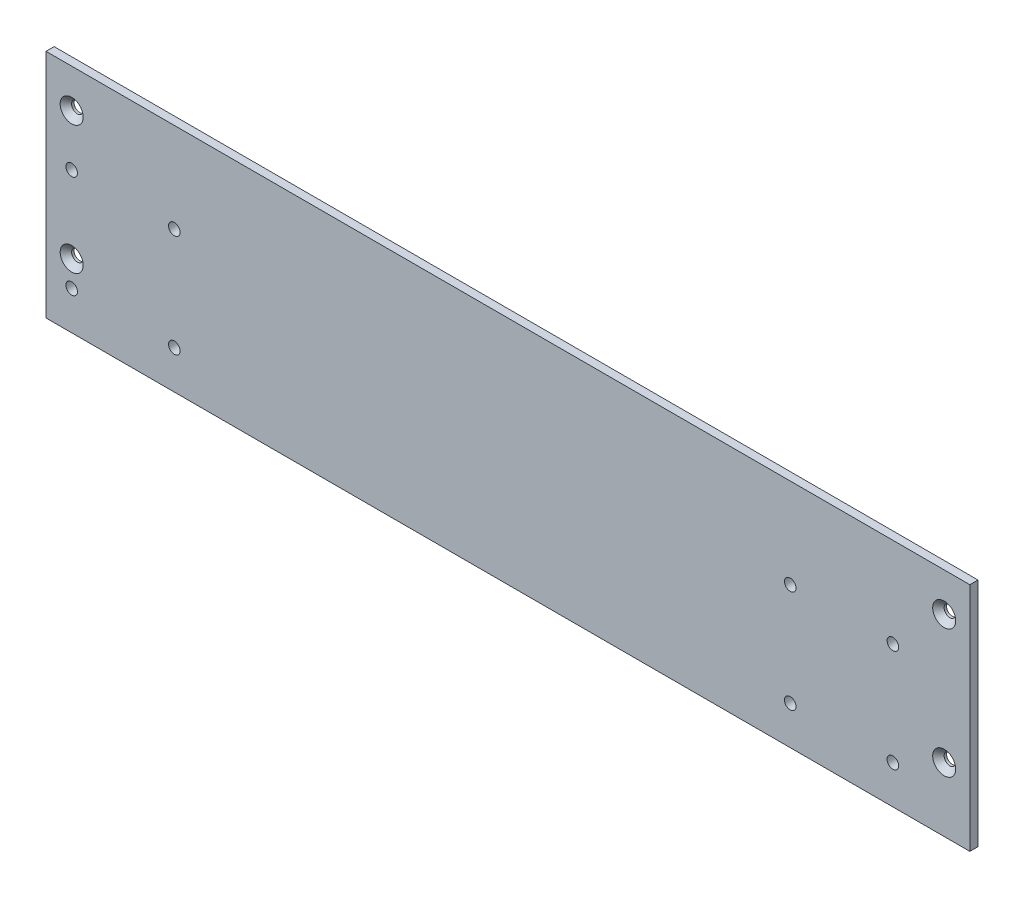
ISO-10303-21;
HEADER;
FILE_DESCRIPTION(('STEP AP214'),'2;1');
FILE_NAME('part.step','',(''),(''),'','','');
FILE_SCHEMA(('AUTOMOTIVE_DESIGN { 1 0 10303 214 1 1 1 1 }'));
ENDSEC;
DATA;
#1=APPLICATION_CONTEXT('core data for automotive mechanical design processes');
#2=APPLICATION_PROTOCOL_DEFINITION('international standard','automotive_design',2000,#1);
#3=PRODUCT_CONTEXT('',#1,'mechanical');
#4=PRODUCT('Part','Part','',(#3));
#5=PRODUCT_RELATED_PRODUCT_CATEGORY('part','',(#4));
#6=PRODUCT_DEFINITION_FORMATION('','',#4);
#7=PRODUCT_DEFINITION_CONTEXT('part definition',#1,'design');
#8=PRODUCT_DEFINITION('design','',#6,#7);
#9=PRODUCT_DEFINITION_SHAPE('','',#8);
#10=(LENGTH_UNIT() NAMED_UNIT(*) SI_UNIT(.MILLI.,.METRE.));
#11=(NAMED_UNIT(*) PLANE_ANGLE_UNIT() SI_UNIT($,.RADIAN.));
#12=(NAMED_UNIT(*) SI_UNIT($,.STERADIAN.) SOLID_ANGLE_UNIT());
#13=UNCERTAINTY_MEASURE_WITH_UNIT(LENGTH_MEASURE(1.E-05),#10,'distance_accuracy_value','');
#14=(GEOMETRIC_REPRESENTATION_CONTEXT(3) GLOBAL_UNCERTAINTY_ASSIGNED_CONTEXT((#13)) GLOBAL_UNIT_ASSIGNED_CONTEXT((#10,
#11,#12)) REPRESENTATION_CONTEXT('',''));
#15=CARTESIAN_POINT('',(0.,0.,0.));
#16=DIRECTION('',(0.,0.,1.));
#17=DIRECTION('',(1.,0.,0.));
#18=AXIS2_PLACEMENT_3D('',#15,#16,#17);
#19=CARTESIAN_POINT('',(0.,0.,3.175));
#20=DIRECTION('',(0.,0.,-1.));
#21=DIRECTION('',(-1.,0.,0.));
#22=AXIS2_PLACEMENT_3D('',#19,#20,#21);
#23=PLANE('',#22);
#24=CARTESIAN_POINT('',(170.,30.,3.175));
#25=DIRECTION('',(0.,0.,1.));
#26=DIRECTION('',(1.,0.,0.));
#27=AXIS2_PLACEMENT_3D('',#24,#25,#26);
#28=CIRCLE('',#27,4.48000000000001);
#29=CARTESIAN_POINT('',(174.48,30.,3.175));
#30=VERTEX_POINT('',#29);
#31=EDGE_CURVE('E237',#30,#30,#28,.T.);
#32=ORIENTED_EDGE('',*,*,#31,.F.);
#33=EDGE_LOOP('',(#32));
#34=FACE_BOUND('',#33,.T.);
#35=CARTESIAN_POINT('',(-170.,-20.,3.175));
#36=DIRECTION('',(0.,0.,1.));
#37=DIRECTION('',(1.,0.,0.));
#38=AXIS2_PLACEMENT_3D('',#35,#36,#37);
#39=CIRCLE('',#38,4.48000000000001);
#40=CARTESIAN_POINT('',(-165.52,-20.,3.175));
#41=VERTEX_POINT('',#40);
#42=EDGE_CURVE('E225',#41,#41,#39,.T.);
#43=ORIENTED_EDGE('',*,*,#42,.F.);
#44=EDGE_LOOP('',(#43));
#45=FACE_BOUND('',#44,.T.);
#46=CARTESIAN_POINT('',(170.,-20.,3.175));
#47=DIRECTION('',(0.,0.,1.));
#48=DIRECTION('',(1.,0.,0.));
#49=AXIS2_PLACEMENT_3D('',#46,#47,#48);
#50=CIRCLE('',#49,4.48000000000001);
#51=CARTESIAN_POINT('',(174.48,-20.,3.175));
#52=VERTEX_POINT('',#51);
#53=EDGE_CURVE('E201',#52,#52,#50,.T.);
#54=ORIENTED_EDGE('',*,*,#53,.F.);
#55=EDGE_LOOP('',(#54));
#56=FACE_BOUND('',#55,.T.);
#57=CARTESIAN_POINT('',(-130.,9.99999999999999,3.175));
#58=DIRECTION('',(0.,0.,1.));
#59=DIRECTION('',(1.,0.,0.));
#60=AXIS2_PLACEMENT_3D('',#57,#58,#59);
#61=CIRCLE('',#60,2.25);
#62=CARTESIAN_POINT('',(-127.75,9.99999999999999,3.175));
#63=VERTEX_POINT('',#62);
#64=EDGE_CURVE('E189',#63,#63,#61,.T.);
#65=ORIENTED_EDGE('',*,*,#64,.F.);
#66=EDGE_LOOP('',(#65));
#67=FACE_BOUND('',#66,.T.);
#68=CARTESIAN_POINT('',(-170.,-30.,3.175));
#69=DIRECTION('',(0.,0.,1.));
#70=DIRECTION('',(1.,0.,0.));
#71=AXIS2_PLACEMENT_3D('',#68,#69,#70);
#72=CIRCLE('',#71,2.25);
#73=CARTESIAN_POINT('',(-167.75,-30.,3.175));
#74=VERTEX_POINT('',#73);
#75=EDGE_CURVE('E181',#74,#74,#72,.T.);
#76=ORIENTED_EDGE('',*,*,#75,.F.);
#77=EDGE_LOOP('',(#76));
#78=FACE_BOUND('',#77,.T.);
#79=CARTESIAN_POINT('',(-170.,9.99999999999999,3.175));
#80=DIRECTION('',(0.,0.,1.));
#81=DIRECTION('',(1.,0.,0.));
#82=AXIS2_PLACEMENT_3D('',#79,#80,#81);
#83=CIRCLE('',#82,2.25);
#84=CARTESIAN_POINT('',(-167.75,9.99999999999999,3.175));
#85=VERTEX_POINT('',#84);
#86=EDGE_CURVE('E173',#85,#85,#83,.T.);
#87=ORIENTED_EDGE('',*,*,#86,.F.);
#88=EDGE_LOOP('',(#87));
#89=FACE_BOUND('',#88,.T.);
#90=CARTESIAN_POINT('',(-130.,-30.,3.175));
#91=DIRECTION('',(0.,0.,1.));
#92=DIRECTION('',(1.,0.,0.));
#93=AXIS2_PLACEMENT_3D('',#90,#91,#92);
#94=CIRCLE('',#93,2.25);
#95=CARTESIAN_POINT('',(-127.75,-30.,3.175));
#96=VERTEX_POINT('',#95);
#97=EDGE_CURVE('E165',#96,#96,#94,.T.);
#98=ORIENTED_EDGE('',*,*,#97,.F.);
#99=EDGE_LOOP('',(#98));
#100=FACE_BOUND('',#99,.T.);
#101=CARTESIAN_POINT('',(110.,10.0000000000035,3.175));
#102=DIRECTION('',(0.,0.,1.));
#103=DIRECTION('',(1.,0.,0.));
#104=AXIS2_PLACEMENT_3D('',#101,#102,#103);
#105=CIRCLE('',#104,2.25);
#106=CARTESIAN_POINT('',(112.25,10.0000000000035,3.175));
#107=VERTEX_POINT('',#106);
#108=EDGE_CURVE('E157',#107,#107,#105,.T.);
#109=ORIENTED_EDGE('',*,*,#108,.F.);
#110=EDGE_LOOP('',(#109));
#111=FACE_BOUND('',#110,.T.);
#112=CARTESIAN_POINT('',(150.,10.000000000004,3.175));
#113=DIRECTION('',(0.,0.,1.));
#114=DIRECTION('',(1.,0.,0.));
#115=AXIS2_PLACEMENT_3D('',#112,#113,#114);
#116=CIRCLE('',#115,2.25);
#117=CARTESIAN_POINT('',(152.25,10.000000000004,3.175));
#118=VERTEX_POINT('',#117);
#119=EDGE_CURVE('E149',#118,#118,#116,.T.);
#120=ORIENTED_EDGE('',*,*,#119,.F.);
#121=EDGE_LOOP('',(#120));
#122=FACE_BOUND('',#121,.T.);
#123=CARTESIAN_POINT('',(150.,-29.999999999996,3.175));
#124=DIRECTION('',(0.,0.,1.));
#125=DIRECTION('',(1.,0.,0.));
#126=AXIS2_PLACEMENT_3D('',#123,#124,#125);
#127=CIRCLE('',#126,2.25);
#128=CARTESIAN_POINT('',(152.25,-29.999999999996,3.175));
#129=VERTEX_POINT('',#128);
#130=EDGE_CURVE('E141',#129,#129,#127,.T.);
#131=ORIENTED_EDGE('',*,*,#130,.F.);
#132=EDGE_LOOP('',(#131));
#133=FACE_BOUND('',#132,.T.);
#134=CARTESIAN_POINT('',(110.,-29.9999999999965,3.175));
#135=DIRECTION('',(0.,0.,1.));
#136=DIRECTION('',(1.,0.,0.));
#137=AXIS2_PLACEMENT_3D('',#134,#135,#136);
#138=CIRCLE('',#137,2.25);
#139=CARTESIAN_POINT('',(112.25,-29.9999999999965,3.175));
#140=VERTEX_POINT('',#139);
#141=EDGE_CURVE('E133',#140,#140,#138,.T.);
#142=ORIENTED_EDGE('',*,*,#141,.F.);
#143=EDGE_LOOP('',(#142));
#144=FACE_BOUND('',#143,.T.);
#145=DIRECTION('',(0.,1.,0.));
#146=VECTOR('',#145,1.);
#147=CARTESIAN_POINT('',(180.,-45.,3.175));
#148=LINE('',#147,#146);
#149=CARTESIAN_POINT('',(180.,-45.,3.175));
#150=VERTEX_POINT('',#149);
#151=CARTESIAN_POINT('',(180.,45.,3.175));
#152=VERTEX_POINT('',#151);
#153=EDGE_CURVE('E92',#150,#152,#148,.T.);
#154=ORIENTED_EDGE('',*,*,#153,.T.);
#155=DIRECTION('',(-1.,0.,0.));
#156=VECTOR('',#155,1.);
#157=CARTESIAN_POINT('',(-180.,45.,3.175));
#158=LINE('',#157,#156);
#159=CARTESIAN_POINT('',(-180.,45.,3.175));
#160=VERTEX_POINT('',#159);
#161=EDGE_CURVE('E87',#152,#160,#158,.T.);
#162=ORIENTED_EDGE('',*,*,#161,.T.);
#163=DIRECTION('',(0.,-1.,0.));
#164=VECTOR('',#163,1.);
#165=CARTESIAN_POINT('',(-180.,-45.,3.175));
#166=LINE('',#165,#164);
#167=CARTESIAN_POINT('',(-180.,-45.,3.175));
#168=VERTEX_POINT('',#167);
#169=EDGE_CURVE('E90',#160,#168,#166,.T.);
#170=ORIENTED_EDGE('',*,*,#169,.T.);
#171=DIRECTION('',(1.,0.,0.));
#172=VECTOR('',#171,1.);
#173=CARTESIAN_POINT('',(-180.,-45.,3.175));
#174=LINE('',#173,#172);
#175=EDGE_CURVE('E57',#168,#150,#174,.T.);
#176=ORIENTED_EDGE('',*,*,#175,.T.);
#177=EDGE_LOOP('',(#154,#162,#170,#176));
#178=FACE_BOUND('',#177,.T.);
#179=CARTESIAN_POINT('',(-170.,30.,3.175));
#180=DIRECTION('',(0.,0.,1.));
#181=DIRECTION('',(1.,0.,0.));
#182=AXIS2_PLACEMENT_3D('',#179,#180,#181);
#183=CIRCLE('',#182,4.48000000000001);
#184=CARTESIAN_POINT('',(-165.52,30.,3.175));
#185=VERTEX_POINT('',#184);
#186=EDGE_CURVE('E213',#185,#185,#183,.T.);
#187=ORIENTED_EDGE('',*,*,#186,.F.);
#188=EDGE_LOOP('',(#187));
#189=FACE_BOUND('',#188,.T.);
#190=ADVANCED_FACE('F39',(#34,#45,#56,#67,#78,#89,#100,#111,#122,#133,#144,#178,#189),#23,.F.);
#191=CARTESIAN_POINT('',(0.,0.,0.));
#192=DIRECTION('',(0.,0.,-1.));
#193=DIRECTION('',(-1.,0.,0.));
#194=AXIS2_PLACEMENT_3D('',#191,#192,#193);
#195=PLANE('',#194);
#196=CARTESIAN_POINT('',(170.,30.,0.));
#197=DIRECTION('',(0.,0.,1.));
#198=DIRECTION('',(1.,0.,0.));
#199=AXIS2_PLACEMENT_3D('',#196,#197,#198);
#200=CIRCLE('',#199,2.25);
#201=CARTESIAN_POINT('',(172.25,30.,0.));
#202=VERTEX_POINT('',#201);
#203=EDGE_CURVE('E229',#202,#202,#200,.T.);
#204=ORIENTED_EDGE('',*,*,#203,.T.);
#205=EDGE_LOOP('',(#204));
#206=FACE_BOUND('',#205,.T.);
#207=CARTESIAN_POINT('',(-170.,-20.,0.));
#208=DIRECTION('',(0.,0.,1.));
#209=DIRECTION('',(1.,0.,0.));
#210=AXIS2_PLACEMENT_3D('',#207,#208,#209);
#211=CIRCLE('',#210,2.25);
#212=CARTESIAN_POINT('',(-167.75,-20.,0.));
#213=VERTEX_POINT('',#212);
#214=EDGE_CURVE('E217',#213,#213,#211,.T.);
#215=ORIENTED_EDGE('',*,*,#214,.T.);
#216=EDGE_LOOP('',(#215));
#217=FACE_BOUND('',#216,.T.);
#218=CARTESIAN_POINT('',(-170.,30.,0.));
#219=DIRECTION('',(0.,0.,1.));
#220=DIRECTION('',(1.,0.,0.));
#221=AXIS2_PLACEMENT_3D('',#218,#219,#220);
#222=CIRCLE('',#221,2.25);
#223=CARTESIAN_POINT('',(-167.75,30.,0.));
#224=VERTEX_POINT('',#223);
#225=EDGE_CURVE('E205',#224,#224,#222,.T.);
#226=ORIENTED_EDGE('',*,*,#225,.T.);
#227=EDGE_LOOP('',(#226));
#228=FACE_BOUND('',#227,.T.);
#229=CARTESIAN_POINT('',(170.,-20.,0.));
#230=DIRECTION('',(0.,0.,1.));
#231=DIRECTION('',(1.,0.,0.));
#232=AXIS2_PLACEMENT_3D('',#229,#230,#231);
#233=CIRCLE('',#232,2.25);
#234=CARTESIAN_POINT('',(172.25,-20.,0.));
#235=VERTEX_POINT('',#234);
#236=EDGE_CURVE('E193',#235,#235,#233,.T.);
#237=ORIENTED_EDGE('',*,*,#236,.T.);
#238=EDGE_LOOP('',(#237));
#239=FACE_BOUND('',#238,.T.);
#240=CARTESIAN_POINT('',(-130.,9.99999999999999,0.));
#241=DIRECTION('',(0.,0.,1.));
#242=DIRECTION('',(1.,0.,0.));
#243=AXIS2_PLACEMENT_3D('',#240,#241,#242);
#244=CIRCLE('',#243,2.25);
#245=CARTESIAN_POINT('',(-127.75,9.99999999999999,0.));
#246=VERTEX_POINT('',#245);
#247=EDGE_CURVE('E185',#246,#246,#244,.T.);
#248=ORIENTED_EDGE('',*,*,#247,.T.);
#249=EDGE_LOOP('',(#248));
#250=FACE_BOUND('',#249,.T.);
#251=CARTESIAN_POINT('',(-170.,-30.,0.));
#252=DIRECTION('',(0.,0.,1.));
#253=DIRECTION('',(1.,0.,0.));
#254=AXIS2_PLACEMENT_3D('',#251,#252,#253);
#255=CIRCLE('',#254,2.25);
#256=CARTESIAN_POINT('',(-167.75,-30.,0.));
#257=VERTEX_POINT('',#256);
#258=EDGE_CURVE('E177',#257,#257,#255,.T.);
#259=ORIENTED_EDGE('',*,*,#258,.T.);
#260=EDGE_LOOP('',(#259));
#261=FACE_BOUND('',#260,.T.);
#262=CARTESIAN_POINT('',(-170.,9.99999999999999,0.));
#263=DIRECTION('',(0.,0.,1.));
#264=DIRECTION('',(1.,0.,0.));
#265=AXIS2_PLACEMENT_3D('',#262,#263,#264);
#266=CIRCLE('',#265,2.25);
#267=CARTESIAN_POINT('',(-167.75,9.99999999999999,0.));
#268=VERTEX_POINT('',#267);
#269=EDGE_CURVE('E169',#268,#268,#266,.T.);
#270=ORIENTED_EDGE('',*,*,#269,.T.);
#271=EDGE_LOOP('',(#270));
#272=FACE_BOUND('',#271,.T.);
#273=DIRECTION('',(0.,1.,0.));
#274=VECTOR('',#273,1.);
#275=CARTESIAN_POINT('',(180.,-45.,0.));
#276=LINE('',#275,#274);
#277=CARTESIAN_POINT('',(180.,-45.,0.));
#278=VERTEX_POINT('',#277);
#279=CARTESIAN_POINT('',(180.,45.,0.));
#280=VERTEX_POINT('',#279);
#281=EDGE_CURVE('E108',#278,#280,#276,.T.);
#282=ORIENTED_EDGE('',*,*,#281,.F.);
#283=DIRECTION('',(1.,0.,0.));
#284=VECTOR('',#283,1.);
#285=CARTESIAN_POINT('',(-180.,-45.,0.));
#286=LINE('',#285,#284);
#287=CARTESIAN_POINT('',(-180.,-45.,0.));
#288=VERTEX_POINT('',#287);
#289=EDGE_CURVE('E80',#288,#278,#286,.T.);
#290=ORIENTED_EDGE('',*,*,#289,.F.);
#291=DIRECTION('',(0.,-1.,0.));
#292=VECTOR('',#291,1.);
#293=CARTESIAN_POINT('',(-180.,-45.,0.));
#294=LINE('',#293,#292);
#295=CARTESIAN_POINT('',(-180.,45.,0.));
#296=VERTEX_POINT('',#295);
#297=EDGE_CURVE('E74',#296,#288,#294,.T.);
#298=ORIENTED_EDGE('',*,*,#297,.F.);
#299=DIRECTION('',(-1.,0.,0.));
#300=VECTOR('',#299,1.);
#301=CARTESIAN_POINT('',(-180.,45.,0.));
#302=LINE('',#301,#300);
#303=EDGE_CURVE('E97',#280,#296,#302,.T.);
#304=ORIENTED_EDGE('',*,*,#303,.F.);
#305=EDGE_LOOP('',(#282,#290,#298,#304));
#306=FACE_BOUND('',#305,.T.);
#307=CARTESIAN_POINT('',(110.,-29.9999999999965,0.));
#308=DIRECTION('',(0.,0.,1.));
#309=DIRECTION('',(1.,0.,0.));
#310=AXIS2_PLACEMENT_3D('',#307,#308,#309);
#311=CIRCLE('',#310,2.25);
#312=CARTESIAN_POINT('',(112.25,-29.9999999999965,0.));
#313=VERTEX_POINT('',#312);
#314=EDGE_CURVE('E112',#313,#313,#311,.T.);
#315=ORIENTED_EDGE('',*,*,#314,.T.);
#316=EDGE_LOOP('',(#315));
#317=FACE_BOUND('',#316,.T.);
#318=CARTESIAN_POINT('',(150.,-29.999999999996,0.));
#319=DIRECTION('',(0.,0.,1.));
#320=DIRECTION('',(1.,0.,0.));
#321=AXIS2_PLACEMENT_3D('',#318,#319,#320);
#322=CIRCLE('',#321,2.25);
#323=CARTESIAN_POINT('',(152.25,-29.999999999996,0.));
#324=VERTEX_POINT('',#323);
#325=EDGE_CURVE('E137',#324,#324,#322,.T.);
#326=ORIENTED_EDGE('',*,*,#325,.T.);
#327=EDGE_LOOP('',(#326));
#328=FACE_BOUND('',#327,.T.);
#329=CARTESIAN_POINT('',(150.,10.000000000004,0.));
#330=DIRECTION('',(0.,0.,1.));
#331=DIRECTION('',(1.,0.,0.));
#332=AXIS2_PLACEMENT_3D('',#329,#330,#331);
#333=CIRCLE('',#332,2.25);
#334=CARTESIAN_POINT('',(152.25,10.000000000004,0.));
#335=VERTEX_POINT('',#334);
#336=EDGE_CURVE('E145',#335,#335,#333,.T.);
#337=ORIENTED_EDGE('',*,*,#336,.T.);
#338=EDGE_LOOP('',(#337));
#339=FACE_BOUND('',#338,.T.);
#340=CARTESIAN_POINT('',(110.,10.0000000000035,0.));
#341=DIRECTION('',(0.,0.,1.));
#342=DIRECTION('',(1.,0.,0.));
#343=AXIS2_PLACEMENT_3D('',#340,#341,#342);
#344=CIRCLE('',#343,2.25);
#345=CARTESIAN_POINT('',(112.25,10.0000000000035,0.));
#346=VERTEX_POINT('',#345);
#347=EDGE_CURVE('E153',#346,#346,#344,.T.);
#348=ORIENTED_EDGE('',*,*,#347,.T.);
#349=EDGE_LOOP('',(#348));
#350=FACE_BOUND('',#349,.T.);
#351=CARTESIAN_POINT('',(-130.,-30.,0.));
#352=DIRECTION('',(0.,0.,1.));
#353=DIRECTION('',(1.,0.,0.));
#354=AXIS2_PLACEMENT_3D('',#351,#352,#353);
#355=CIRCLE('',#354,2.25);
#356=CARTESIAN_POINT('',(-127.75,-30.,0.));
#357=VERTEX_POINT('',#356);
#358=EDGE_CURVE('E161',#357,#357,#355,.T.);
#359=ORIENTED_EDGE('',*,*,#358,.T.);
#360=EDGE_LOOP('',(#359));
#361=FACE_BOUND('',#360,.T.);
#362=ADVANCED_FACE('F125',(#206,#217,#228,#239,#250,#261,#272,#306,#317,#328,#339,#350,#361),
#195,.T.);
#363=CARTESIAN_POINT('',(180.,-45.,3.175));
#364=DIRECTION('',(-1.,0.,0.));
#365=DIRECTION('',(0.,0.,1.));
#366=AXIS2_PLACEMENT_3D('',#363,#364,#365);
#367=PLANE('',#366);
#368=ORIENTED_EDGE('',*,*,#281,.T.);
#369=DIRECTION('',(0.,0.,-1.));
#370=VECTOR('',#369,1.);
#371=CARTESIAN_POINT('',(180.,45.,3.175));
#372=LINE('',#371,#370);
#373=EDGE_CURVE('E11',#152,#280,#372,.T.);
#374=ORIENTED_EDGE('',*,*,#373,.F.);
#375=ORIENTED_EDGE('',*,*,#153,.F.);
#376=DIRECTION('',(0.,0.,-1.));
#377=VECTOR('',#376,1.);
#378=CARTESIAN_POINT('',(180.,-45.,3.175));
#379=LINE('',#378,#377);
#380=EDGE_CURVE('E104',#150,#278,#379,.T.);
#381=ORIENTED_EDGE('',*,*,#380,.T.);
#382=EDGE_LOOP('',(#368,#374,#375,#381));
#383=FACE_BOUND('',#382,.T.);
#384=ADVANCED_FACE('F41',(#383),#367,.F.);
#385=CARTESIAN_POINT('',(-180.,45.,3.175));
#386=DIRECTION('',(0.,-1.,0.));
#387=DIRECTION('',(0.,0.,-1.));
#388=AXIS2_PLACEMENT_3D('',#385,#386,#387);
#389=PLANE('',#388);
#390=ORIENTED_EDGE('',*,*,#303,.T.);
#391=DIRECTION('',(0.,0.,-1.));
#392=VECTOR('',#391,1.);
#393=CARTESIAN_POINT('',(-180.,45.,3.175));
#394=LINE('',#393,#392);
#395=EDGE_CURVE('E49',#160,#296,#394,.T.);
#396=ORIENTED_EDGE('',*,*,#395,.F.);
#397=ORIENTED_EDGE('',*,*,#161,.F.);
#398=ORIENTED_EDGE('',*,*,#373,.T.);
#399=EDGE_LOOP('',(#390,#396,#397,#398));
#400=FACE_BOUND('',#399,.T.);
#401=ADVANCED_FACE('F96',(#400),#389,.F.);
#402=CARTESIAN_POINT('',(-180.,-45.,3.175));
#403=DIRECTION('',(1.,0.,0.));
#404=DIRECTION('',(0.,0.,-1.));
#405=AXIS2_PLACEMENT_3D('',#402,#403,#404);
#406=PLANE('',#405);
#407=ORIENTED_EDGE('',*,*,#297,.T.);
#408=DIRECTION('',(0.,0.,-1.));
#409=VECTOR('',#408,1.);
#410=CARTESIAN_POINT('',(-180.,-45.,3.175));
#411=LINE('',#410,#409);
#412=EDGE_CURVE('E99',#168,#288,#411,.T.);
#413=ORIENTED_EDGE('',*,*,#412,.F.);
#414=ORIENTED_EDGE('',*,*,#169,.F.);
#415=ORIENTED_EDGE('',*,*,#395,.T.);
#416=EDGE_LOOP('',(#407,#413,#414,#415));
#417=FACE_BOUND('',#416,.T.);
#418=ADVANCED_FACE('F100',(#417),#406,.F.);
#419=CARTESIAN_POINT('',(-180.,-45.,3.175));
#420=DIRECTION('',(0.,1.,0.));
#421=DIRECTION('',(0.,0.,1.));
#422=AXIS2_PLACEMENT_3D('',#419,#420,#421);
#423=PLANE('',#422);
#424=ORIENTED_EDGE('',*,*,#289,.T.);
#425=ORIENTED_EDGE('',*,*,#380,.F.);
#426=ORIENTED_EDGE('',*,*,#175,.F.);
#427=ORIENTED_EDGE('',*,*,#412,.T.);
#428=EDGE_LOOP('',(#424,#425,#426,#427));
#429=FACE_BOUND('',#428,.T.);
#430=ADVANCED_FACE('F122',(#429),#423,.F.);
#431=CARTESIAN_POINT('',(110.,-29.9999999999965,3.175));
#432=DIRECTION('',(0.,0.,1.));
#433=DIRECTION('',(1.,0.,0.));
#434=AXIS2_PLACEMENT_3D('',#431,#432,#433);
#435=CYLINDRICAL_SURFACE('',#434,2.25);
#436=ORIENTED_EDGE('',*,*,#314,.F.);
#437=EDGE_LOOP('',(#436));
#438=FACE_BOUND('',#437,.T.);
#439=ORIENTED_EDGE('',*,*,#141,.T.);
#440=EDGE_LOOP('',(#439));
#441=FACE_BOUND('',#440,.T.);
#442=ADVANCED_FACE('F267',(#438,#441),#435,.F.);
#443=CARTESIAN_POINT('',(150.,-29.999999999996,3.175));
#444=DIRECTION('',(0.,0.,1.));
#445=DIRECTION('',(1.,0.,0.));
#446=AXIS2_PLACEMENT_3D('',#443,#444,#445);
#447=CYLINDRICAL_SURFACE('',#446,2.25);
#448=ORIENTED_EDGE('',*,*,#325,.F.);
#449=EDGE_LOOP('',(#448));
#450=FACE_BOUND('',#449,.T.);
#451=ORIENTED_EDGE('',*,*,#130,.T.);
#452=EDGE_LOOP('',(#451));
#453=FACE_BOUND('',#452,.T.);
#454=ADVANCED_FACE('F269',(#450,#453),#447,.F.);
#455=CARTESIAN_POINT('',(150.,10.000000000004,3.175));
#456=DIRECTION('',(0.,0.,1.));
#457=DIRECTION('',(1.,0.,0.));
#458=AXIS2_PLACEMENT_3D('',#455,#456,#457);
#459=CYLINDRICAL_SURFACE('',#458,2.25);
#460=ORIENTED_EDGE('',*,*,#336,.F.);
#461=EDGE_LOOP('',(#460));
#462=FACE_BOUND('',#461,.T.);
#463=ORIENTED_EDGE('',*,*,#119,.T.);
#464=EDGE_LOOP('',(#463));
#465=FACE_BOUND('',#464,.T.);
#466=ADVANCED_FACE('F276',(#462,#465),#459,.F.);
#467=CARTESIAN_POINT('',(110.,10.0000000000035,3.175));
#468=DIRECTION('',(0.,0.,1.));
#469=DIRECTION('',(1.,0.,0.));
#470=AXIS2_PLACEMENT_3D('',#467,#468,#469);
#471=CYLINDRICAL_SURFACE('',#470,2.25);
#472=ORIENTED_EDGE('',*,*,#347,.F.);
#473=EDGE_LOOP('',(#472));
#474=FACE_BOUND('',#473,.T.);
#475=ORIENTED_EDGE('',*,*,#108,.T.);
#476=EDGE_LOOP('',(#475));
#477=FACE_BOUND('',#476,.T.);
#478=ADVANCED_FACE('F345',(#474,#477),#471,.F.);
#479=CARTESIAN_POINT('',(-130.,-30.,3.175));
#480=DIRECTION('',(0.,0.,1.));
#481=DIRECTION('',(1.,0.,0.));
#482=AXIS2_PLACEMENT_3D('',#479,#480,#481);
#483=CYLINDRICAL_SURFACE('',#482,2.25);
#484=ORIENTED_EDGE('',*,*,#358,.F.);
#485=EDGE_LOOP('',(#484));
#486=FACE_BOUND('',#485,.T.);
#487=ORIENTED_EDGE('',*,*,#97,.T.);
#488=EDGE_LOOP('',(#487));
#489=FACE_BOUND('',#488,.T.);
#490=ADVANCED_FACE('F335',(#486,#489),#483,.F.);
#491=CARTESIAN_POINT('',(-170.,9.99999999999999,3.175));
#492=DIRECTION('',(0.,0.,1.));
#493=DIRECTION('',(1.,0.,0.));
#494=AXIS2_PLACEMENT_3D('',#491,#492,#493);
#495=CYLINDRICAL_SURFACE('',#494,2.25);
#496=ORIENTED_EDGE('',*,*,#269,.F.);
#497=EDGE_LOOP('',(#496));
#498=FACE_BOUND('',#497,.T.);
#499=ORIENTED_EDGE('',*,*,#86,.T.);
#500=EDGE_LOOP('',(#499));
#501=FACE_BOUND('',#500,.T.);
#502=ADVANCED_FACE('F325',(#498,#501),#495,.F.);
#503=CARTESIAN_POINT('',(-170.,-30.,3.175));
#504=DIRECTION('',(0.,0.,1.));
#505=DIRECTION('',(1.,0.,0.));
#506=AXIS2_PLACEMENT_3D('',#503,#504,#505);
#507=CYLINDRICAL_SURFACE('',#506,2.25);
#508=ORIENTED_EDGE('',*,*,#258,.F.);
#509=EDGE_LOOP('',(#508));
#510=FACE_BOUND('',#509,.T.);
#511=ORIENTED_EDGE('',*,*,#75,.T.);
#512=EDGE_LOOP('',(#511));
#513=FACE_BOUND('',#512,.T.);
#514=ADVANCED_FACE('F314',(#510,#513),#507,.F.);
#515=CARTESIAN_POINT('',(-130.,9.99999999999999,3.175));
#516=DIRECTION('',(0.,0.,1.));
#517=DIRECTION('',(1.,0.,0.));
#518=AXIS2_PLACEMENT_3D('',#515,#516,#517);
#519=CYLINDRICAL_SURFACE('',#518,2.25);
#520=ORIENTED_EDGE('',*,*,#247,.F.);
#521=EDGE_LOOP('',(#520));
#522=FACE_BOUND('',#521,.T.);
#523=ORIENTED_EDGE('',*,*,#64,.T.);
#524=EDGE_LOOP('',(#523));
#525=FACE_BOUND('',#524,.T.);
#526=ADVANCED_FACE('F309',(#522,#525),#519,.F.);
#527=CARTESIAN_POINT('',(170.,-20.,3.175));
#528=DIRECTION('',(0.,0.,1.));
#529=DIRECTION('',(1.,0.,0.));
#530=AXIS2_PLACEMENT_3D('',#527,#528,#529);
#531=CYLINDRICAL_SURFACE('',#530,2.25);
#532=ORIENTED_EDGE('',*,*,#236,.F.);
#533=EDGE_LOOP('',(#532));
#534=FACE_BOUND('',#533,.T.);
#535=CARTESIAN_POINT('',(170.,-20.,0.945000000000001));
#536=DIRECTION('',(0.,0.,1.));
#537=DIRECTION('',(1.,0.,0.));
#538=AXIS2_PLACEMENT_3D('',#535,#536,#537);
#539=CIRCLE('',#538,2.25);
#540=CARTESIAN_POINT('',(172.25,-20.,0.945000000000001));
#541=VERTEX_POINT('',#540);
#542=EDGE_CURVE('E197',#541,#541,#539,.T.);
#543=ORIENTED_EDGE('',*,*,#542,.T.);
#544=EDGE_LOOP('',(#543));
#545=FACE_BOUND('',#544,.T.);
#546=ADVANCED_FACE('F313',(#534,#545),#531,.F.);
#547=CARTESIAN_POINT('',(170.,-20.,3.175));
#548=DIRECTION('',(0.,0.,1.));
#549=DIRECTION('',(1.,0.,0.));
#550=AXIS2_PLACEMENT_3D('',#547,#548,#549);
#551=CONICAL_SURFACE('',#550,4.48000000000001,0.785398163397451);
#552=ORIENTED_EDGE('',*,*,#542,.F.);
#553=EDGE_LOOP('',(#552));
#554=FACE_BOUND('',#553,.T.);
#555=ORIENTED_EDGE('',*,*,#53,.T.);
#556=EDGE_LOOP('',(#555));
#557=FACE_BOUND('',#556,.T.);
#558=ADVANCED_FACE('F401',(#554,#557),#551,.F.);
#559=CARTESIAN_POINT('',(-170.,30.,3.175));
#560=DIRECTION('',(0.,0.,1.));
#561=DIRECTION('',(1.,0.,0.));
#562=AXIS2_PLACEMENT_3D('',#559,#560,#561);
#563=CYLINDRICAL_SURFACE('',#562,2.25);
#564=ORIENTED_EDGE('',*,*,#225,.F.);
#565=EDGE_LOOP('',(#564));
#566=FACE_BOUND('',#565,.T.);
#567=CARTESIAN_POINT('',(-170.,30.,0.945000000000001));
#568=DIRECTION('',(0.,0.,1.));
#569=DIRECTION('',(1.,0.,0.));
#570=AXIS2_PLACEMENT_3D('',#567,#568,#569);
#571=CIRCLE('',#570,2.25);
#572=CARTESIAN_POINT('',(-167.75,30.,0.945000000000001));
#573=VERTEX_POINT('',#572);
#574=EDGE_CURVE('E209',#573,#573,#571,.T.);
#575=ORIENTED_EDGE('',*,*,#574,.T.);
#576=EDGE_LOOP('',(#575));
#577=FACE_BOUND('',#576,.T.);
#578=ADVANCED_FACE('F405',(#566,#577),#563,.F.);
#579=CARTESIAN_POINT('',(-170.,30.,3.175));
#580=DIRECTION('',(0.,0.,1.));
#581=DIRECTION('',(1.,0.,0.));
#582=AXIS2_PLACEMENT_3D('',#579,#580,#581);
#583=CONICAL_SURFACE('',#582,4.48000000000001,0.785398163397451);
#584=ORIENTED_EDGE('',*,*,#574,.F.);
#585=EDGE_LOOP('',(#584));
#586=FACE_BOUND('',#585,.T.);
#587=ORIENTED_EDGE('',*,*,#186,.T.);
#588=EDGE_LOOP('',(#587));
#589=FACE_BOUND('',#588,.T.);
#590=ADVANCED_FACE('F409',(#586,#589),#583,.F.);
#591=CARTESIAN_POINT('',(-170.,-20.,3.175));
#592=DIRECTION('',(0.,0.,1.));
#593=DIRECTION('',(1.,0.,0.));
#594=AXIS2_PLACEMENT_3D('',#591,#592,#593);
#595=CYLINDRICAL_SURFACE('',#594,2.25);
#596=ORIENTED_EDGE('',*,*,#214,.F.);
#597=EDGE_LOOP('',(#596));
#598=FACE_BOUND('',#597,.T.);
#599=CARTESIAN_POINT('',(-170.,-20.,0.945000000000001));
#600=DIRECTION('',(0.,0.,1.));
#601=DIRECTION('',(1.,0.,0.));
#602=AXIS2_PLACEMENT_3D('',#599,#600,#601);
#603=CIRCLE('',#602,2.25);
#604=CARTESIAN_POINT('',(-167.75,-20.,0.945000000000001));
#605=VERTEX_POINT('',#604);
#606=EDGE_CURVE('E221',#605,#605,#603,.T.);
#607=ORIENTED_EDGE('',*,*,#606,.T.);
#608=EDGE_LOOP('',(#607));
#609=FACE_BOUND('',#608,.T.);
#610=ADVANCED_FACE('F413',(#598,#609),#595,.F.);
#611=CARTESIAN_POINT('',(-170.,-20.,3.175));
#612=DIRECTION('',(0.,0.,1.));
#613=DIRECTION('',(1.,0.,0.));
#614=AXIS2_PLACEMENT_3D('',#611,#612,#613);
#615=CONICAL_SURFACE('',#614,4.48000000000001,0.785398163397451);
#616=ORIENTED_EDGE('',*,*,#606,.F.);
#617=EDGE_LOOP('',(#616));
#618=FACE_BOUND('',#617,.T.);
#619=ORIENTED_EDGE('',*,*,#42,.T.);
#620=EDGE_LOOP('',(#619));
#621=FACE_BOUND('',#620,.T.);
#622=ADVANCED_FACE('F417',(#618,#621),#615,.F.);
#623=CARTESIAN_POINT('',(170.,30.,3.175));
#624=DIRECTION('',(0.,0.,1.));
#625=DIRECTION('',(1.,0.,0.));
#626=AXIS2_PLACEMENT_3D('',#623,#624,#625);
#627=CYLINDRICAL_SURFACE('',#626,2.25);
#628=ORIENTED_EDGE('',*,*,#203,.F.);
#629=EDGE_LOOP('',(#628));
#630=FACE_BOUND('',#629,.T.);
#631=CARTESIAN_POINT('',(170.,30.,0.945000000000001));
#632=DIRECTION('',(0.,0.,1.));
#633=DIRECTION('',(1.,0.,0.));
#634=AXIS2_PLACEMENT_3D('',#631,#632,#633);
#635=CIRCLE('',#634,2.25);
#636=CARTESIAN_POINT('',(172.25,30.,0.945000000000001));
#637=VERTEX_POINT('',#636);
#638=EDGE_CURVE('E233',#637,#637,#635,.T.);
#639=ORIENTED_EDGE('',*,*,#638,.T.);
#640=EDGE_LOOP('',(#639));
#641=FACE_BOUND('',#640,.T.);
#642=ADVANCED_FACE('F421',(#630,#641),#627,.F.);
#643=CARTESIAN_POINT('',(170.,30.,3.175));
#644=DIRECTION('',(0.,0.,1.));
#645=DIRECTION('',(1.,0.,0.));
#646=AXIS2_PLACEMENT_3D('',#643,#644,#645);
#647=CONICAL_SURFACE('',#646,4.48000000000001,0.785398163397451);
#648=ORIENTED_EDGE('',*,*,#638,.F.);
#649=EDGE_LOOP('',(#648));
#650=FACE_BOUND('',#649,.T.);
#651=ORIENTED_EDGE('',*,*,#31,.T.);
#652=EDGE_LOOP('',(#651));
#653=FACE_BOUND('',#652,.T.);
#654=ADVANCED_FACE('F242',(#650,#653),#647,.F.);
#655=CLOSED_SHELL('',(#190,#362,#384,#401,#418,#430,#442,#454,#466,#478,#490,#502,#514,#526,
#546,#558,#578,#590,#610,#622,#642,#654));
#656=MANIFOLD_SOLID_BREP('B2',#655);
#657=ADVANCED_BREP_SHAPE_REPRESENTATION('',(#18,#656),#14);
#658=SHAPE_DEFINITION_REPRESENTATION(#9,#657);
ENDSEC;
END-ISO-10303-21;
